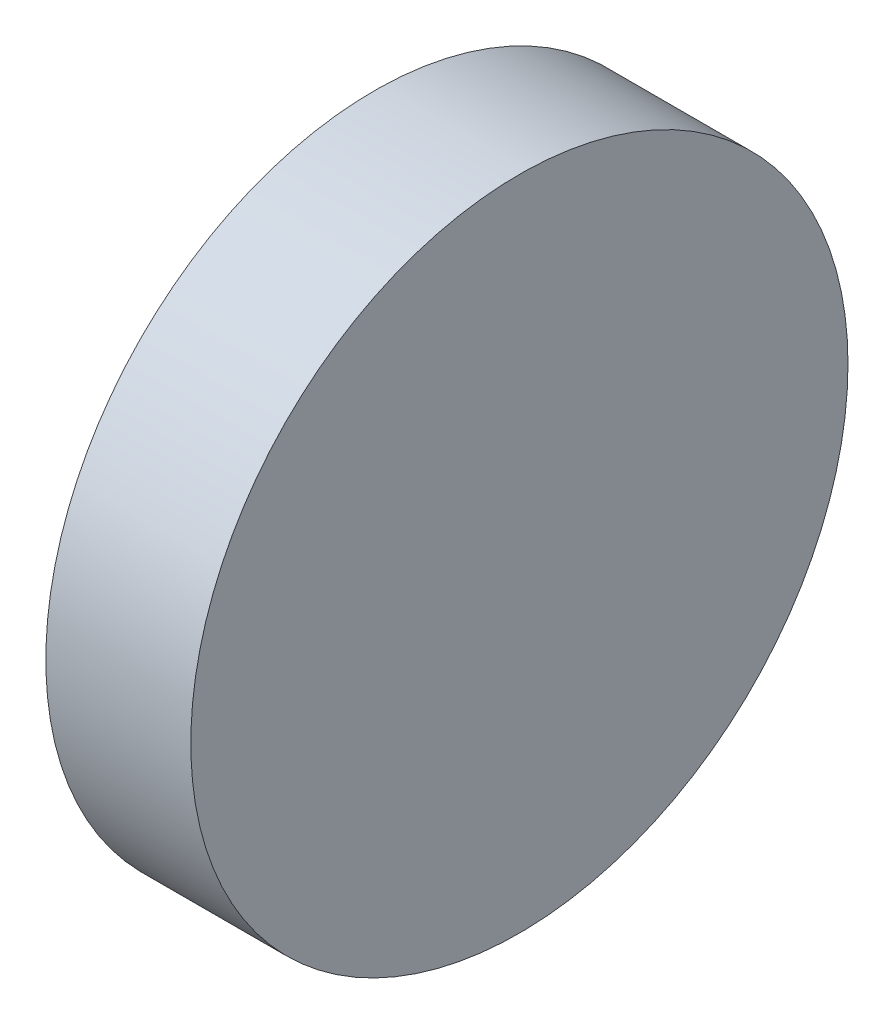
ISO-10303-21;
HEADER;
FILE_DESCRIPTION(('STEP AP214'),'2;1');
FILE_NAME('part.step','',(''),(''),'','','');
FILE_SCHEMA(('AUTOMOTIVE_DESIGN { 1 0 10303 214 1 1 1 1 }'));
ENDSEC;
DATA;
#1=APPLICATION_CONTEXT('core data for automotive mechanical design processes');
#2=APPLICATION_PROTOCOL_DEFINITION('international standard','automotive_design',2000,#1);
#3=PRODUCT_CONTEXT('',#1,'mechanical');
#4=PRODUCT('Part','Part','',(#3));
#5=PRODUCT_RELATED_PRODUCT_CATEGORY('part','',(#4));
#6=PRODUCT_DEFINITION_FORMATION('','',#4);
#7=PRODUCT_DEFINITION_CONTEXT('part definition',#1,'design');
#8=PRODUCT_DEFINITION('design','',#6,#7);
#9=PRODUCT_DEFINITION_SHAPE('','',#8);
#10=(LENGTH_UNIT() NAMED_UNIT(*) SI_UNIT(.MILLI.,.METRE.));
#11=(NAMED_UNIT(*) PLANE_ANGLE_UNIT() SI_UNIT($,.RADIAN.));
#12=(NAMED_UNIT(*) SI_UNIT($,.STERADIAN.) SOLID_ANGLE_UNIT());
#13=UNCERTAINTY_MEASURE_WITH_UNIT(LENGTH_MEASURE(1.E-05),#10,'distance_accuracy_value','');
#14=(GEOMETRIC_REPRESENTATION_CONTEXT(3) GLOBAL_UNCERTAINTY_ASSIGNED_CONTEXT((#13)) GLOBAL_UNIT_ASSIGNED_CONTEXT((#10,
#11,#12)) REPRESENTATION_CONTEXT('',''));
#15=CARTESIAN_POINT('',(0.,0.,0.));
#16=DIRECTION('',(0.,0.,1.));
#17=DIRECTION('',(1.,0.,0.));
#18=AXIS2_PLACEMENT_3D('',#15,#16,#17);
#19=CARTESIAN_POINT('',(1.8,0.,0.75));
#20=DIRECTION('',(1.,0.,0.));
#21=DIRECTION('',(0.,0.,-1.));
#22=AXIS2_PLACEMENT_3D('',#19,#20,#21);
#23=PLANE('',#22);
#24=CARTESIAN_POINT('',(1.8,0.,0.75));
#25=DIRECTION('',(1.,0.,0.));
#26=DIRECTION('',(0.,0.,-1.));
#27=AXIS2_PLACEMENT_3D('',#24,#25,#26);
#28=CIRCLE('',#27,0.680000007153);
#29=CARTESIAN_POINT('',(1.8,0.,0.069999992847));
#30=VERTEX_POINT('',#29);
#31=EDGE_CURVE('E18',#30,#30,#28,.T.);
#32=ORIENTED_EDGE('',*,*,#31,.F.);
#33=EDGE_LOOP('',(#32));
#34=FACE_BOUND('',#33,.T.);
#35=ADVANCED_FACE('F15',(#34),#23,.F.);
#36=CARTESIAN_POINT('',(1.8,0.,0.75));
#37=DIRECTION('',(1.,0.,0.));
#38=DIRECTION('',(0.,0.,-1.));
#39=AXIS2_PLACEMENT_3D('',#36,#37,#38);
#40=CYLINDRICAL_SURFACE('',#39,0.680000007153);
#41=ORIENTED_EDGE('',*,*,#31,.T.);
#42=EDGE_LOOP('',(#41));
#43=FACE_BOUND('',#42,.T.);
#44=CARTESIAN_POINT('',(2.100000011921,0.,0.75));
#45=DIRECTION('',(1.,0.,0.));
#46=DIRECTION('',(0.,0.,-1.));
#47=AXIS2_PLACEMENT_3D('',#44,#45,#46);
#48=CIRCLE('',#47,0.680000007153);
#49=CARTESIAN_POINT('',(2.100000011921,0.,0.0699999928470001));
#50=VERTEX_POINT('',#49);
#51=EDGE_CURVE('E10',#50,#50,#48,.T.);
#52=ORIENTED_EDGE('',*,*,#51,.F.);
#53=EDGE_LOOP('',(#52));
#54=FACE_BOUND('',#53,.T.);
#55=ADVANCED_FACE('F27',(#43,#54),#40,.T.);
#56=CARTESIAN_POINT('',(2.100000011921,0.,0.75));
#57=DIRECTION('',(1.,0.,0.));
#58=DIRECTION('',(0.,0.,-1.));
#59=AXIS2_PLACEMENT_3D('',#56,#57,#58);
#60=PLANE('',#59);
#61=ORIENTED_EDGE('',*,*,#51,.T.);
#62=EDGE_LOOP('',(#61));
#63=FACE_BOUND('',#62,.T.);
#64=ADVANCED_FACE('F35',(#63),#60,.T.);
#65=CLOSED_SHELL('',(#35,#55,#64));
#66=MANIFOLD_SOLID_BREP('B1',#65);
#67=ADVANCED_BREP_SHAPE_REPRESENTATION('',(#18,#66),#14);
#68=SHAPE_DEFINITION_REPRESENTATION(#9,#67);
ENDSEC;
END-ISO-10303-21;
